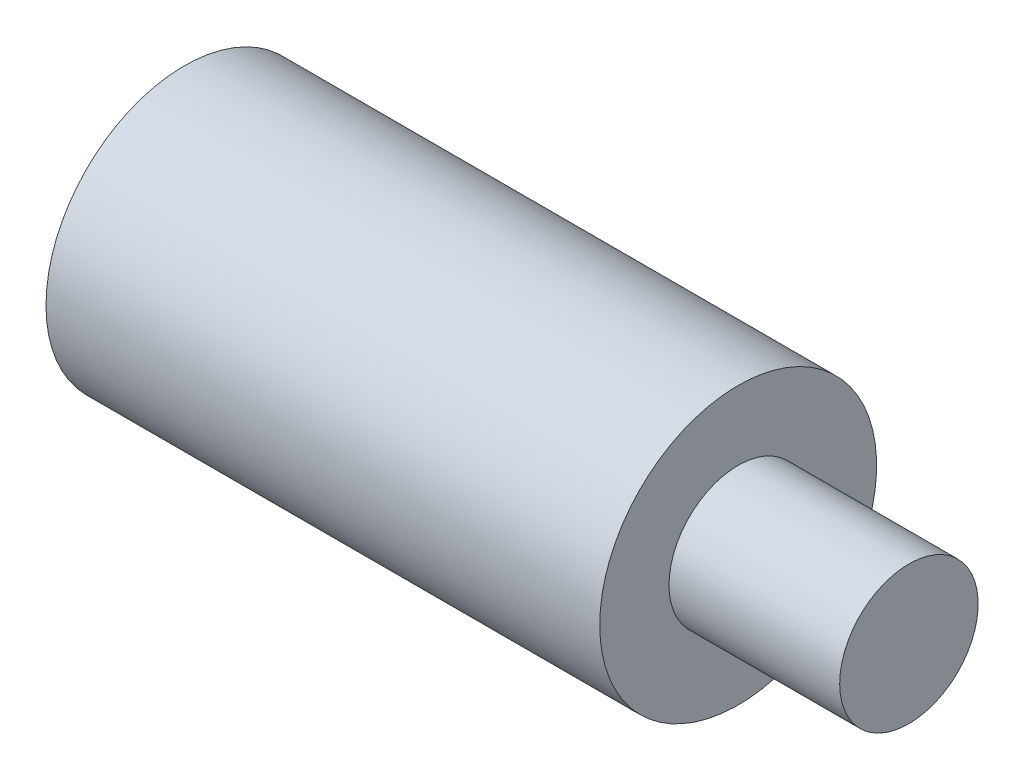
ISO-10303-21;
HEADER;
FILE_DESCRIPTION(('STEP AP214'),'2;1');
FILE_NAME('part.step','',(''),(''),'','','');
FILE_SCHEMA(('AUTOMOTIVE_DESIGN { 1 0 10303 214 1 1 1 1 }'));
ENDSEC;
DATA;
#1=APPLICATION_CONTEXT('core data for automotive mechanical design processes');
#2=APPLICATION_PROTOCOL_DEFINITION('international standard','automotive_design',2000,#1);
#3=PRODUCT_CONTEXT('',#1,'mechanical');
#4=PRODUCT('Part','Part','',(#3));
#5=PRODUCT_RELATED_PRODUCT_CATEGORY('part','',(#4));
#6=PRODUCT_DEFINITION_FORMATION('','',#4);
#7=PRODUCT_DEFINITION_CONTEXT('part definition',#1,'design');
#8=PRODUCT_DEFINITION('design','',#6,#7);
#9=PRODUCT_DEFINITION_SHAPE('','',#8);
#10=(LENGTH_UNIT() NAMED_UNIT(*) SI_UNIT(.MILLI.,.METRE.));
#11=(NAMED_UNIT(*) PLANE_ANGLE_UNIT() SI_UNIT($,.RADIAN.));
#12=(NAMED_UNIT(*) SI_UNIT($,.STERADIAN.) SOLID_ANGLE_UNIT());
#13=UNCERTAINTY_MEASURE_WITH_UNIT(LENGTH_MEASURE(1.E-05),#10,'distance_accuracy_value','');
#14=(GEOMETRIC_REPRESENTATION_CONTEXT(3) GLOBAL_UNCERTAINTY_ASSIGNED_CONTEXT((#13)) GLOBAL_UNIT_ASSIGNED_CONTEXT((#10,
#11,#12)) REPRESENTATION_CONTEXT('',''));
#15=CARTESIAN_POINT('',(0.,0.,0.));
#16=DIRECTION('',(0.,0.,1.));
#17=DIRECTION('',(1.,0.,0.));
#18=AXIS2_PLACEMENT_3D('',#15,#16,#17);
#19=CARTESIAN_POINT('',(3.5,-1.5,0.));
#20=DIRECTION('',(1.,0.,0.));
#21=DIRECTION('',(0.,0.,-1.));
#22=AXIS2_PLACEMENT_3D('',#19,#20,#21);
#23=PLANE('',#22);
#24=CARTESIAN_POINT('',(3.5,0.,0.));
#25=DIRECTION('',(-1.,0.,0.));
#26=DIRECTION('',(0.,0.,1.));
#27=AXIS2_PLACEMENT_3D('',#24,#25,#26);
#28=CIRCLE('',#27,1.5);
#29=CARTESIAN_POINT('',(3.5,0.,1.5));
#30=VERTEX_POINT('',#29);
#31=EDGE_CURVE('E104',#30,#30,#28,.T.);
#32=ORIENTED_EDGE('',*,*,#31,.T.);
#33=EDGE_LOOP('',(#32));
#34=FACE_BOUND('',#33,.T.);
#35=CARTESIAN_POINT('',(3.5,0.,0.));
#36=DIRECTION('',(-1.,0.,0.));
#37=DIRECTION('',(0.,0.,1.));
#38=AXIS2_PLACEMENT_3D('',#35,#36,#37);
#39=CIRCLE('',#38,3.00000000000001);
#40=CARTESIAN_POINT('',(3.5,0.,3.00000000000001));
#41=VERTEX_POINT('',#40);
#42=EDGE_CURVE('E79',#41,#41,#39,.T.);
#43=ORIENTED_EDGE('',*,*,#42,.F.);
#44=EDGE_LOOP('',(#43));
#45=FACE_BOUND('',#44,.T.);
#46=ADVANCED_FACE('F31',(#34,#45),#23,.T.);
#47=CARTESIAN_POINT('',(-97.0893551688843,0.,0.));
#48=DIRECTION('',(-1.,0.,0.));
#49=DIRECTION('',(0.,0.,1.));
#50=AXIS2_PLACEMENT_3D('',#47,#48,#49);
#51=CYLINDRICAL_SURFACE('',#50,3.00000000000001);
#52=ORIENTED_EDGE('',*,*,#42,.T.);
#53=EDGE_LOOP('',(#52));
#54=FACE_BOUND('',#53,.T.);
#55=CARTESIAN_POINT('',(-8.49999999999999,0.,0.));
#56=DIRECTION('',(-1.,0.,0.));
#57=DIRECTION('',(0.,0.,1.));
#58=AXIS2_PLACEMENT_3D('',#55,#56,#57);
#59=CIRCLE('',#58,3.00000000000001);
#60=CARTESIAN_POINT('',(-8.49999999999999,0.,3.00000000000001));
#61=VERTEX_POINT('',#60);
#62=EDGE_CURVE('E77',#61,#61,#59,.T.);
#63=ORIENTED_EDGE('',*,*,#62,.F.);
#64=EDGE_LOOP('',(#63));
#65=FACE_BOUND('',#64,.T.);
#66=ADVANCED_FACE('F59',(#54,#65),#51,.T.);
#67=CARTESIAN_POINT('',(-8.49999999999999,-3.00000000000001,0.));
#68=DIRECTION('',(-1.,0.,0.));
#69=DIRECTION('',(0.,0.,1.));
#70=AXIS2_PLACEMENT_3D('',#67,#68,#69);
#71=PLANE('',#70);
#72=CARTESIAN_POINT('',(-8.49999999999999,0.,0.));
#73=DIRECTION('',(-1.,0.,0.));
#74=DIRECTION('',(0.,0.,1.));
#75=AXIS2_PLACEMENT_3D('',#72,#73,#74);
#76=CIRCLE('',#75,1.6);
#77=CARTESIAN_POINT('',(-8.49999999999999,0.,1.6));
#78=VERTEX_POINT('',#77);
#79=EDGE_CURVE('E11',#78,#78,#76,.F.);
#80=ORIENTED_EDGE('',*,*,#79,.T.);
#81=EDGE_LOOP('',(#80));
#82=FACE_BOUND('',#81,.T.);
#83=ORIENTED_EDGE('',*,*,#62,.T.);
#84=EDGE_LOOP('',(#83));
#85=FACE_BOUND('',#84,.T.);
#86=ADVANCED_FACE('F54',(#82,#85),#71,.T.);
#87=CARTESIAN_POINT('',(-97.0893551688843,0.,0.));
#88=DIRECTION('',(-1.,0.,0.));
#89=DIRECTION('',(0.,0.,1.));
#90=AXIS2_PLACEMENT_3D('',#87,#88,#89);
#91=CYLINDRICAL_SURFACE('',#90,1.2);
#92=CARTESIAN_POINT('',(-8.1,0.,0.));
#93=DIRECTION('',(-1.,0.,0.));
#94=DIRECTION('',(0.,0.,1.));
#95=AXIS2_PLACEMENT_3D('',#92,#93,#94);
#96=CIRCLE('',#95,1.2);
#97=CARTESIAN_POINT('',(-8.1,0.,1.2));
#98=VERTEX_POINT('',#97);
#99=EDGE_CURVE('E38',#98,#98,#96,.T.);
#100=ORIENTED_EDGE('',*,*,#99,.T.);
#101=EDGE_LOOP('',(#100));
#102=FACE_BOUND('',#101,.T.);
#103=CARTESIAN_POINT('',(-0.5,0.,0.));
#104=DIRECTION('',(-1.,0.,0.));
#105=DIRECTION('',(0.,0.,1.));
#106=AXIS2_PLACEMENT_3D('',#103,#104,#105);
#107=CIRCLE('',#106,1.2);
#108=CARTESIAN_POINT('',(-0.5,0.,1.2));
#109=VERTEX_POINT('',#108);
#110=EDGE_CURVE('E80',#109,#109,#107,.T.);
#111=ORIENTED_EDGE('',*,*,#110,.F.);
#112=EDGE_LOOP('',(#111));
#113=FACE_BOUND('',#112,.T.);
#114=ADVANCED_FACE('F44',(#102,#113),#91,.F.);
#115=CARTESIAN_POINT('',(0.299999999999995,0.,0.));
#116=DIRECTION('',(-1.,0.,0.));
#117=DIRECTION('',(0.,0.,1.));
#118=AXIS2_PLACEMENT_3D('',#115,#116,#117);
#119=CONICAL_SURFACE('',#118,0.,0.982793723247332);
#120=ORIENTED_EDGE('',*,*,#110,.T.);
#121=EDGE_LOOP('',(#120));
#122=FACE_BOUND('',#121,.T.);
#123=CARTESIAN_POINT('',(0.299999999999995,0.,0.));
#124=VERTEX_POINT('',#123);
#125=VERTEX_LOOP('',#124);
#126=FACE_BOUND('',#125,.T.);
#127=ADVANCED_FACE('F41',(#122,#126),#119,.F.);
#128=CARTESIAN_POINT('',(7.2,-1.5,0.));
#129=DIRECTION('',(1.,0.,0.));
#130=DIRECTION('',(0.,0.,-1.));
#131=AXIS2_PLACEMENT_3D('',#128,#129,#130);
#132=PLANE('',#131);
#133=CARTESIAN_POINT('',(7.2,0.,0.));
#134=DIRECTION('',(-1.,0.,0.));
#135=DIRECTION('',(0.,0.,1.));
#136=AXIS2_PLACEMENT_3D('',#133,#134,#135);
#137=CIRCLE('',#136,1.5);
#138=CARTESIAN_POINT('',(7.2,0.,1.5));
#139=VERTEX_POINT('',#138);
#140=EDGE_CURVE('E84',#139,#139,#137,.T.);
#141=ORIENTED_EDGE('',*,*,#140,.F.);
#142=EDGE_LOOP('',(#141));
#143=FACE_BOUND('',#142,.T.);
#144=ADVANCED_FACE('F43',(#143),#132,.T.);
#145=CARTESIAN_POINT('',(-97.0893551688843,0.,0.));
#146=DIRECTION('',(-1.,0.,0.));
#147=DIRECTION('',(0.,0.,1.));
#148=AXIS2_PLACEMENT_3D('',#145,#146,#147);
#149=CYLINDRICAL_SURFACE('',#148,1.5);
#150=ORIENTED_EDGE('',*,*,#140,.T.);
#151=EDGE_LOOP('',(#150));
#152=FACE_BOUND('',#151,.T.);
#153=ORIENTED_EDGE('',*,*,#31,.F.);
#154=EDGE_LOOP('',(#153));
#155=FACE_BOUND('',#154,.T.);
#156=ADVANCED_FACE('F51',(#152,#155),#149,.T.);
#157=CARTESIAN_POINT('',(-8.1,0.,0.));
#158=DIRECTION('',(-1.,0.,0.));
#159=DIRECTION('',(0.,0.,1.));
#160=AXIS2_PLACEMENT_3D('',#157,#158,#159);
#161=CONICAL_SURFACE('',#160,1.2,0.785398163397453);
#162=ORIENTED_EDGE('',*,*,#79,.F.);
#163=EDGE_LOOP('',(#162));
#164=FACE_BOUND('',#163,.T.);
#165=ORIENTED_EDGE('',*,*,#99,.F.);
#166=EDGE_LOOP('',(#165));
#167=FACE_BOUND('',#166,.T.);
#168=ADVANCED_FACE('F33',(#164,#167),#161,.F.);
#169=CLOSED_SHELL('',(#46,#66,#86,#114,#127,#144,#156,#168));
#170=MANIFOLD_SOLID_BREP('B2',#169);
#171=ADVANCED_BREP_SHAPE_REPRESENTATION('',(#18,#170),#14);
#172=SHAPE_DEFINITION_REPRESENTATION(#9,#171);
ENDSEC;
END-ISO-10303-21;
